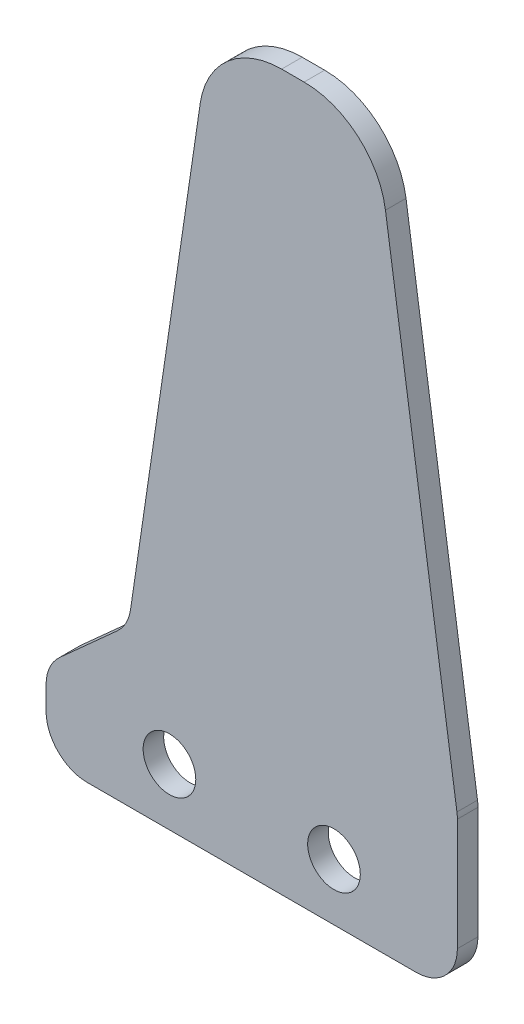
ISO-10303-21;
HEADER;
FILE_DESCRIPTION(('STEP AP214'),'2;1');
FILE_NAME('part.step','',(''),(''),'','','');
FILE_SCHEMA(('AUTOMOTIVE_DESIGN { 1 0 10303 214 1 1 1 1 }'));
ENDSEC;
DATA;
#1=APPLICATION_CONTEXT('core data for automotive mechanical design processes');
#2=APPLICATION_PROTOCOL_DEFINITION('international standard','automotive_design',2000,#1);
#3=PRODUCT_CONTEXT('',#1,'mechanical');
#4=PRODUCT('Part','Part','',(#3));
#5=PRODUCT_RELATED_PRODUCT_CATEGORY('part','',(#4));
#6=PRODUCT_DEFINITION_FORMATION('','',#4);
#7=PRODUCT_DEFINITION_CONTEXT('part definition',#1,'design');
#8=PRODUCT_DEFINITION('design','',#6,#7);
#9=PRODUCT_DEFINITION_SHAPE('','',#8);
#10=(LENGTH_UNIT() NAMED_UNIT(*) SI_UNIT(.MILLI.,.METRE.));
#11=(NAMED_UNIT(*) PLANE_ANGLE_UNIT() SI_UNIT($,.RADIAN.));
#12=(NAMED_UNIT(*) SI_UNIT($,.STERADIAN.) SOLID_ANGLE_UNIT());
#13=UNCERTAINTY_MEASURE_WITH_UNIT(LENGTH_MEASURE(1.E-05),#10,'distance_accuracy_value','');
#14=(GEOMETRIC_REPRESENTATION_CONTEXT(3) GLOBAL_UNCERTAINTY_ASSIGNED_CONTEXT((#13)) GLOBAL_UNIT_ASSIGNED_CONTEXT((#10,
#11,#12)) REPRESENTATION_CONTEXT('',''));
#15=CARTESIAN_POINT('',(0.,0.,0.));
#16=DIRECTION('',(0.,0.,1.));
#17=DIRECTION('',(1.,0.,0.));
#18=AXIS2_PLACEMENT_3D('',#15,#16,#17);
#19=CARTESIAN_POINT('',(0.,0.,1.5875));
#20=DIRECTION('',(0.,0.,1.));
#21=DIRECTION('',(1.,0.,0.));
#22=AXIS2_PLACEMENT_3D('',#19,#20,#21);
#23=PLANE('',#22);
#24=CARTESIAN_POINT('',(0.,0.,1.5875));
#25=DIRECTION('',(0.,0.,1.));
#26=DIRECTION('',(1.,0.,0.));
#27=AXIS2_PLACEMENT_3D('',#24,#25,#26);
#28=CIRCLE('',#27,2.032);
#29=CARTESIAN_POINT('',(2.032,0.,1.5875));
#30=VERTEX_POINT('',#29);
#31=EDGE_CURVE('E277',#30,#30,#28,.T.);
#32=ORIENTED_EDGE('',*,*,#31,.F.);
#33=EDGE_LOOP('',(#32));
#34=FACE_BOUND('',#33,.T.);
#35=DIRECTION('',(0.,1.,0.));
#36=VECTOR('',#35,1.);
#37=CARTESIAN_POINT('',(9.52500000000001,-4.3923682963395,1.5875));
#38=LINE('',#37,#36);
#39=CARTESIAN_POINT('',(9.52500000000001,-1.2173682963395,1.5875));
#40=VERTEX_POINT('',#39);
#41=CARTESIAN_POINT('',(9.52500000000001,7.43902293067184,1.5875));
#42=VERTEX_POINT('',#41);
#43=EDGE_CURVE('E270',#40,#42,#38,.T.);
#44=ORIENTED_EDGE('',*,*,#43,.T.);
#45=CARTESIAN_POINT('',(6.35000000000001,7.43902293067184,1.5875));
#46=DIRECTION('',(0.,0.,1.));
#47=DIRECTION('',(1.,0.,0.));
#48=AXIS2_PLACEMENT_3D('',#45,#46,#47);
#49=CIRCLE('',#48,3.175);
#50=CARTESIAN_POINT('',(9.49113580168159,7.90150630917772,1.5875));
#51=VERTEX_POINT('',#50);
#52=EDGE_CURVE('E244',#42,#51,#49,.T.);
#53=ORIENTED_EDGE('',*,*,#52,.T.);
#54=DIRECTION('',(-0.145664056222325,0.989334110765852,0.));
#55=VECTOR('',#54,1.);
#56=CARTESIAN_POINT('',(9.52500000000001,7.67150443088994,1.5875));
#57=LINE('',#56,#55);
#58=CARTESIAN_POINT('',(3.97375174495187,45.3749667570118,1.5875));
#59=VERTEX_POINT('',#58);
#60=EDGE_CURVE('E300',#51,#59,#57,.T.);
#61=ORIENTED_EDGE('',*,*,#60,.T.);
#62=CARTESIAN_POINT('',(-2.30851985841129,44.45,1.5875));
#63=DIRECTION('',(0.,0.,1.));
#64=DIRECTION('',(1.,0.,0.));
#65=AXIS2_PLACEMENT_3D('',#62,#63,#64);
#66=CIRCLE('',#65,6.35);
#67=CARTESIAN_POINT('',(-2.30851985841129,50.8,1.5875));
#68=VERTEX_POINT('',#67);
#69=EDGE_CURVE('E212',#59,#68,#66,.T.);
#70=ORIENTED_EDGE('',*,*,#69,.T.);
#71=DIRECTION('',(-1.,0.,0.));
#72=VECTOR('',#71,1.);
#73=CARTESIAN_POINT('',(3.17500000000001,50.8,1.5875));
#74=LINE('',#73,#72);
#75=CARTESIAN_POINT('',(-4.04148014158869,50.8,1.5875));
#76=VERTEX_POINT('',#75);
#77=EDGE_CURVE('E299',#68,#76,#74,.T.);
#78=ORIENTED_EDGE('',*,*,#77,.T.);
#79=CARTESIAN_POINT('',(-4.04148014158869,44.45,1.5875));
#80=DIRECTION('',(0.,0.,1.));
#81=DIRECTION('',(1.,0.,0.));
#82=AXIS2_PLACEMENT_3D('',#79,#80,#81);
#83=CIRCLE('',#82,6.35);
#84=CARTESIAN_POINT('',(-10.3237517449519,45.3749667570118,1.5875));
#85=VERTEX_POINT('',#84);
#86=EDGE_CURVE('E214',#76,#85,#83,.T.);
#87=ORIENTED_EDGE('',*,*,#86,.T.);
#88=DIRECTION('',(-0.145664056222325,-0.989334110765852,0.));
#89=VECTOR('',#88,1.);
#90=CARTESIAN_POINT('',(-9.52499999999999,50.8,1.5875));
#91=LINE('',#90,#89);
#92=CARTESIAN_POINT('',(-15.708301166504,8.80370441542636,1.5875));
#93=VERTEX_POINT('',#92);
#94=EDGE_CURVE('E182',#85,#93,#91,.T.);
#95=ORIENTED_EDGE('',*,*,#94,.T.);
#96=CARTESIAN_POINT('',(-18.8494369681856,9.26618779393224,1.5875));
#97=DIRECTION('',(0.,0.,1.));
#98=DIRECTION('',(1.,0.,0.));
#99=AXIS2_PLACEMENT_3D('',#96,#97,#98);
#100=CIRCLE('',#99,3.175);
#101=CARTESIAN_POINT('',(-16.7257054387108,6.90602055606234,1.5875));
#102=VERTEX_POINT('',#101);
#103=EDGE_CURVE('E11',#93,#102,#100,.F.);
#104=ORIENTED_EDGE('',*,*,#103,.T.);
#105=DIRECTION('',(-0.743359759959024,-0.668891820307037,0.));
#106=VECTOR('',#105,1.);
#107=CARTESIAN_POINT('',(-15.875,7.67150443088994,1.5875));
#108=LINE('',#107,#106);
#109=CARTESIAN_POINT('',(-21.1737315294748,2.9035867025156,1.5875));
#110=VERTEX_POINT('',#109);
#111=EDGE_CURVE('E268',#102,#110,#108,.T.);
#112=ORIENTED_EDGE('',*,*,#111,.T.);
#113=CARTESIAN_POINT('',(-19.05,0.5434194646457,1.5875));
#114=DIRECTION('',(0.,0.,1.));
#115=DIRECTION('',(1.,0.,0.));
#116=AXIS2_PLACEMENT_3D('',#113,#114,#115);
#117=CIRCLE('',#116,3.175);
#118=CARTESIAN_POINT('',(-22.225,0.5434194646457,1.5875));
#119=VERTEX_POINT('',#118);
#120=EDGE_CURVE('E237',#110,#119,#117,.T.);
#121=ORIENTED_EDGE('',*,*,#120,.T.);
#122=DIRECTION('',(0.,-1.,0.));
#123=VECTOR('',#122,1.);
#124=CARTESIAN_POINT('',(-22.225,1.9576317036605,1.5875));
#125=LINE('',#124,#123);
#126=CARTESIAN_POINT('',(-22.225,-1.2173682963395,1.5875));
#127=VERTEX_POINT('',#126);
#128=EDGE_CURVE('E183',#119,#127,#125,.T.);
#129=ORIENTED_EDGE('',*,*,#128,.T.);
#130=CARTESIAN_POINT('',(-19.05,-1.2173682963395,1.5875));
#131=DIRECTION('',(0.,0.,1.));
#132=DIRECTION('',(1.,0.,0.));
#133=AXIS2_PLACEMENT_3D('',#130,#131,#132);
#134=CIRCLE('',#133,3.175);
#135=CARTESIAN_POINT('',(-19.05,-4.3923682963395,1.5875));
#136=VERTEX_POINT('',#135);
#137=EDGE_CURVE('E73',#127,#136,#134,.T.);
#138=ORIENTED_EDGE('',*,*,#137,.T.);
#139=DIRECTION('',(1.,0.,0.));
#140=VECTOR('',#139,1.);
#141=CARTESIAN_POINT('',(-22.225,-4.3923682963395,1.5875));
#142=LINE('',#141,#140);
#143=CARTESIAN_POINT('',(6.35,-4.3923682963395,1.5875));
#144=VERTEX_POINT('',#143);
#145=EDGE_CURVE('E205',#136,#144,#142,.T.);
#146=ORIENTED_EDGE('',*,*,#145,.T.);
#147=CARTESIAN_POINT('',(6.35000000000001,-1.2173682963395,1.5875));
#148=DIRECTION('',(0.,0.,1.));
#149=DIRECTION('',(1.,0.,0.));
#150=AXIS2_PLACEMENT_3D('',#147,#148,#149);
#151=CIRCLE('',#150,3.175);
#152=EDGE_CURVE('E242',#144,#40,#151,.T.);
#153=ORIENTED_EDGE('',*,*,#152,.T.);
#154=EDGE_LOOP('',(#44,#53,#61,#70,#78,#87,#95,#104,#112,#121,#129,#138,#146,#153));
#155=FACE_BOUND('',#154,.T.);
#156=CARTESIAN_POINT('',(-12.7,0.,1.5875));
#157=DIRECTION('',(0.,0.,1.));
#158=DIRECTION('',(1.,0.,0.));
#159=AXIS2_PLACEMENT_3D('',#156,#157,#158);
#160=CIRCLE('',#159,2.032);
#161=CARTESIAN_POINT('',(-10.668,0.,1.5875));
#162=VERTEX_POINT('',#161);
#163=EDGE_CURVE('E341',#162,#162,#160,.T.);
#164=ORIENTED_EDGE('',*,*,#163,.F.);
#165=EDGE_LOOP('',(#164));
#166=FACE_BOUND('',#165,.T.);
#167=ADVANCED_FACE('F47',(#34,#155,#166),#23,.T.);
#168=CARTESIAN_POINT('',(0.,0.,0.));
#169=DIRECTION('',(0.,0.,1.));
#170=DIRECTION('',(1.,0.,0.));
#171=AXIS2_PLACEMENT_3D('',#168,#169,#170);
#172=PLANE('',#171);
#173=DIRECTION('',(-0.145664056222325,0.989334110765852,0.));
#174=VECTOR('',#173,1.);
#175=CARTESIAN_POINT('',(9.52500000000001,7.67150443088994,0.));
#176=LINE('',#175,#174);
#177=CARTESIAN_POINT('',(9.49113580168159,7.90150630917772,0.));
#178=VERTEX_POINT('',#177);
#179=CARTESIAN_POINT('',(3.97375174495187,45.3749667570118,0.));
#180=VERTEX_POINT('',#179);
#181=EDGE_CURVE('E199',#178,#180,#176,.T.);
#182=ORIENTED_EDGE('',*,*,#181,.F.);
#183=CARTESIAN_POINT('',(6.35000000000001,7.43902293067184,0.));
#184=DIRECTION('',(0.,0.,1.));
#185=DIRECTION('',(1.,0.,0.));
#186=AXIS2_PLACEMENT_3D('',#183,#184,#185);
#187=CIRCLE('',#186,3.175);
#188=CARTESIAN_POINT('',(9.52500000000001,7.43902293067184,0.));
#189=VERTEX_POINT('',#188);
#190=EDGE_CURVE('E230',#178,#189,#187,.F.);
#191=ORIENTED_EDGE('',*,*,#190,.T.);
#192=DIRECTION('',(0.,1.,0.));
#193=VECTOR('',#192,1.);
#194=CARTESIAN_POINT('',(9.52500000000001,-4.3923682963395,0.));
#195=LINE('',#194,#193);
#196=CARTESIAN_POINT('',(9.52500000000001,-1.2173682963395,0.));
#197=VERTEX_POINT('',#196);
#198=EDGE_CURVE('E276',#197,#189,#195,.T.);
#199=ORIENTED_EDGE('',*,*,#198,.F.);
#200=CARTESIAN_POINT('',(6.35000000000001,-1.2173682963395,0.));
#201=DIRECTION('',(0.,0.,1.));
#202=DIRECTION('',(1.,0.,0.));
#203=AXIS2_PLACEMENT_3D('',#200,#201,#202);
#204=CIRCLE('',#203,3.175);
#205=CARTESIAN_POINT('',(6.35,-4.3923682963395,0.));
#206=VERTEX_POINT('',#205);
#207=EDGE_CURVE('E228',#197,#206,#204,.F.);
#208=ORIENTED_EDGE('',*,*,#207,.T.);
#209=DIRECTION('',(1.,0.,0.));
#210=VECTOR('',#209,1.);
#211=CARTESIAN_POINT('',(-22.225,-4.3923682963395,0.));
#212=LINE('',#211,#210);
#213=CARTESIAN_POINT('',(-19.05,-4.3923682963395,0.));
#214=VERTEX_POINT('',#213);
#215=EDGE_CURVE('E275',#214,#206,#212,.T.);
#216=ORIENTED_EDGE('',*,*,#215,.F.);
#217=CARTESIAN_POINT('',(-19.05,-1.2173682963395,0.));
#218=DIRECTION('',(0.,0.,1.));
#219=DIRECTION('',(1.,0.,0.));
#220=AXIS2_PLACEMENT_3D('',#217,#218,#219);
#221=CIRCLE('',#220,3.175);
#222=CARTESIAN_POINT('',(-22.225,-1.2173682963395,0.));
#223=VERTEX_POINT('',#222);
#224=EDGE_CURVE('E225',#214,#223,#221,.F.);
#225=ORIENTED_EDGE('',*,*,#224,.T.);
#226=DIRECTION('',(0.,-1.,0.));
#227=VECTOR('',#226,1.);
#228=CARTESIAN_POINT('',(-22.225,1.9576317036605,0.));
#229=LINE('',#228,#227);
#230=CARTESIAN_POINT('',(-22.225,0.5434194646457,0.));
#231=VERTEX_POINT('',#230);
#232=EDGE_CURVE('E197',#231,#223,#229,.T.);
#233=ORIENTED_EDGE('',*,*,#232,.F.);
#234=CARTESIAN_POINT('',(-19.05,0.5434194646457,0.));
#235=DIRECTION('',(0.,0.,1.));
#236=DIRECTION('',(1.,0.,0.));
#237=AXIS2_PLACEMENT_3D('',#234,#235,#236);
#238=CIRCLE('',#237,3.175);
#239=CARTESIAN_POINT('',(-21.1737315294748,2.9035867025156,0.));
#240=VERTEX_POINT('',#239);
#241=EDGE_CURVE('E222',#231,#240,#238,.F.);
#242=ORIENTED_EDGE('',*,*,#241,.T.);
#243=DIRECTION('',(-0.743359759959024,-0.668891820307037,0.));
#244=VECTOR('',#243,1.);
#245=CARTESIAN_POINT('',(-15.875,7.67150443088994,0.));
#246=LINE('',#245,#244);
#247=CARTESIAN_POINT('',(-16.7257054387108,6.90602055606234,0.));
#248=VERTEX_POINT('',#247);
#249=EDGE_CURVE('E190',#248,#240,#246,.T.);
#250=ORIENTED_EDGE('',*,*,#249,.F.);
#251=CARTESIAN_POINT('',(-18.8494369681856,9.26618779393224,0.));
#252=DIRECTION('',(0.,0.,1.));
#253=DIRECTION('',(1.,0.,0.));
#254=AXIS2_PLACEMENT_3D('',#251,#252,#253);
#255=CIRCLE('',#254,3.175);
#256=CARTESIAN_POINT('',(-15.708301166504,8.80370441542636,0.));
#257=VERTEX_POINT('',#256);
#258=EDGE_CURVE('E56',#248,#257,#255,.T.);
#259=ORIENTED_EDGE('',*,*,#258,.T.);
#260=DIRECTION('',(-0.145664056222325,-0.989334110765852,0.));
#261=VECTOR('',#260,1.);
#262=CARTESIAN_POINT('',(-9.52499999999999,50.8,0.));
#263=LINE('',#262,#261);
#264=CARTESIAN_POINT('',(-10.3237517449519,45.3749667570118,0.));
#265=VERTEX_POINT('',#264);
#266=EDGE_CURVE('E179',#265,#257,#263,.T.);
#267=ORIENTED_EDGE('',*,*,#266,.F.);
#268=CARTESIAN_POINT('',(-4.04148014158869,44.45,0.));
#269=DIRECTION('',(0.,0.,1.));
#270=DIRECTION('',(1.,0.,0.));
#271=AXIS2_PLACEMENT_3D('',#268,#269,#270);
#272=CIRCLE('',#271,6.35);
#273=CARTESIAN_POINT('',(-4.04148014158869,50.8,0.));
#274=VERTEX_POINT('',#273);
#275=EDGE_CURVE('E162',#265,#274,#272,.F.);
#276=ORIENTED_EDGE('',*,*,#275,.T.);
#277=DIRECTION('',(-1.,0.,0.));
#278=VECTOR('',#277,1.);
#279=CARTESIAN_POINT('',(3.17500000000001,50.8,0.));
#280=LINE('',#279,#278);
#281=CARTESIAN_POINT('',(-2.30851985841129,50.8,0.));
#282=VERTEX_POINT('',#281);
#283=EDGE_CURVE('E191',#282,#274,#280,.T.);
#284=ORIENTED_EDGE('',*,*,#283,.F.);
#285=CARTESIAN_POINT('',(-2.30851985841129,44.45,0.));
#286=DIRECTION('',(0.,0.,1.));
#287=DIRECTION('',(1.,0.,0.));
#288=AXIS2_PLACEMENT_3D('',#285,#286,#287);
#289=CIRCLE('',#288,6.35);
#290=EDGE_CURVE('E173',#282,#180,#289,.F.);
#291=ORIENTED_EDGE('',*,*,#290,.T.);
#292=EDGE_LOOP('',(#182,#191,#199,#208,#216,#225,#233,#242,#250,#259,#267,#276,#284,#291));
#293=FACE_BOUND('',#292,.T.);
#294=CARTESIAN_POINT('',(0.,0.,0.));
#295=DIRECTION('',(0.,0.,1.));
#296=DIRECTION('',(1.,0.,0.));
#297=AXIS2_PLACEMENT_3D('',#294,#295,#296);
#298=CIRCLE('',#297,2.032);
#299=CARTESIAN_POINT('',(2.032,0.,0.));
#300=VERTEX_POINT('',#299);
#301=EDGE_CURVE('E283',#300,#300,#298,.T.);
#302=ORIENTED_EDGE('',*,*,#301,.T.);
#303=EDGE_LOOP('',(#302));
#304=FACE_BOUND('',#303,.T.);
#305=CARTESIAN_POINT('',(-12.7,0.,0.));
#306=DIRECTION('',(0.,0.,1.));
#307=DIRECTION('',(1.,0.,0.));
#308=AXIS2_PLACEMENT_3D('',#305,#306,#307);
#309=CIRCLE('',#308,2.032);
#310=CARTESIAN_POINT('',(-10.668,0.,0.));
#311=VERTEX_POINT('',#310);
#312=EDGE_CURVE('E343',#311,#311,#309,.T.);
#313=ORIENTED_EDGE('',*,*,#312,.T.);
#314=EDGE_LOOP('',(#313));
#315=FACE_BOUND('',#314,.T.);
#316=ADVANCED_FACE('F186',(#293,#304,#315),#172,.F.);
#317=CARTESIAN_POINT('',(-22.225,-4.3923682963395,1.5875));
#318=DIRECTION('',(0.,1.,0.));
#319=DIRECTION('',(0.,0.,1.));
#320=AXIS2_PLACEMENT_3D('',#317,#318,#319);
#321=PLANE('',#320);
#322=ORIENTED_EDGE('',*,*,#215,.T.);
#323=DIRECTION('',(0.,0.,-1.));
#324=VECTOR('',#323,1.);
#325=CARTESIAN_POINT('',(6.35,-4.3923682963395,1.5875));
#326=LINE('',#325,#324);
#327=EDGE_CURVE('E63',#206,#144,#326,.F.);
#328=ORIENTED_EDGE('',*,*,#327,.T.);
#329=ORIENTED_EDGE('',*,*,#145,.F.);
#330=DIRECTION('',(0.,0.,-1.));
#331=VECTOR('',#330,1.);
#332=CARTESIAN_POINT('',(-19.05,-4.3923682963395,1.5875));
#333=LINE('',#332,#331);
#334=EDGE_CURVE('E246',#136,#214,#333,.T.);
#335=ORIENTED_EDGE('',*,*,#334,.T.);
#336=EDGE_LOOP('',(#322,#328,#329,#335));
#337=FACE_BOUND('',#336,.T.);
#338=ADVANCED_FACE('F326',(#337),#321,.F.);
#339=CARTESIAN_POINT('',(9.52500000000001,-4.3923682963395,1.5875));
#340=DIRECTION('',(-1.,0.,0.));
#341=DIRECTION('',(0.,0.,1.));
#342=AXIS2_PLACEMENT_3D('',#339,#340,#341);
#343=PLANE('',#342);
#344=ORIENTED_EDGE('',*,*,#198,.T.);
#345=DIRECTION('',(0.,0.,-1.));
#346=VECTOR('',#345,1.);
#347=CARTESIAN_POINT('',(9.52500000000001,7.43902293067184,1.5875));
#348=LINE('',#347,#346);
#349=EDGE_CURVE('E235',#189,#42,#348,.F.);
#350=ORIENTED_EDGE('',*,*,#349,.T.);
#351=ORIENTED_EDGE('',*,*,#43,.F.);
#352=DIRECTION('',(0.,0.,-1.));
#353=VECTOR('',#352,1.);
#354=CARTESIAN_POINT('',(9.52500000000001,-1.2173682963395,1.5875));
#355=LINE('',#354,#353);
#356=EDGE_CURVE('E232',#40,#197,#355,.T.);
#357=ORIENTED_EDGE('',*,*,#356,.T.);
#358=EDGE_LOOP('',(#344,#350,#351,#357));
#359=FACE_BOUND('',#358,.T.);
#360=ADVANCED_FACE('F334',(#359),#343,.F.);
#361=CARTESIAN_POINT('',(9.52500000000001,7.67150443088994,1.5875));
#362=DIRECTION('',(-0.989334110765852,-0.145664056222325,0.));
#363=DIRECTION('',(0.145664056222325,-0.989334110765852,0.));
#364=AXIS2_PLACEMENT_3D('',#361,#362,#363);
#365=PLANE('',#364);
#366=ORIENTED_EDGE('',*,*,#60,.F.);
#367=DIRECTION('',(0.,0.,-1.));
#368=VECTOR('',#367,1.);
#369=CARTESIAN_POINT('',(9.49113580168159,7.90150630917772,1.5875));
#370=LINE('',#369,#368);
#371=EDGE_CURVE('E219',#51,#178,#370,.T.);
#372=ORIENTED_EDGE('',*,*,#371,.T.);
#373=ORIENTED_EDGE('',*,*,#181,.T.);
#374=DIRECTION('',(0.,0.,-1.));
#375=VECTOR('',#374,1.);
#376=CARTESIAN_POINT('',(3.97375174495187,45.3749667570118,1.5875));
#377=LINE('',#376,#375);
#378=EDGE_CURVE('E216',#180,#59,#377,.F.);
#379=ORIENTED_EDGE('',*,*,#378,.T.);
#380=EDGE_LOOP('',(#366,#372,#373,#379));
#381=FACE_BOUND('',#380,.T.);
#382=ADVANCED_FACE('F288',(#381),#365,.F.);
#383=CARTESIAN_POINT('',(3.17500000000001,50.8,1.5875));
#384=DIRECTION('',(0.,-1.,0.));
#385=DIRECTION('',(0.,0.,-1.));
#386=AXIS2_PLACEMENT_3D('',#383,#384,#385);
#387=PLANE('',#386);
#388=ORIENTED_EDGE('',*,*,#283,.T.);
#389=DIRECTION('',(0.,0.,-1.));
#390=VECTOR('',#389,1.);
#391=CARTESIAN_POINT('',(-4.04148014158869,50.8,1.5875));
#392=LINE('',#391,#390);
#393=EDGE_CURVE('E167',#274,#76,#392,.F.);
#394=ORIENTED_EDGE('',*,*,#393,.T.);
#395=ORIENTED_EDGE('',*,*,#77,.F.);
#396=DIRECTION('',(0.,0.,-1.));
#397=VECTOR('',#396,1.);
#398=CARTESIAN_POINT('',(-2.30851985841129,50.8,1.5875));
#399=LINE('',#398,#397);
#400=EDGE_CURVE('E172',#68,#282,#399,.T.);
#401=ORIENTED_EDGE('',*,*,#400,.T.);
#402=EDGE_LOOP('',(#388,#394,#395,#401));
#403=FACE_BOUND('',#402,.T.);
#404=ADVANCED_FACE('F302',(#403),#387,.F.);
#405=CARTESIAN_POINT('',(-9.52499999999999,50.8,1.5875));
#406=DIRECTION('',(0.989334110765852,-0.145664056222325,0.));
#407=DIRECTION('',(0.145664056222325,0.989334110765852,0.));
#408=AXIS2_PLACEMENT_3D('',#405,#406,#407);
#409=PLANE('',#408);
#410=ORIENTED_EDGE('',*,*,#266,.T.);
#411=DIRECTION('',(0.,0.,-1.));
#412=VECTOR('',#411,1.);
#413=CARTESIAN_POINT('',(-15.708301166504,8.80370441542636,1.5875));
#414=LINE('',#413,#412);
#415=EDGE_CURVE('E265',#257,#93,#414,.F.);
#416=ORIENTED_EDGE('',*,*,#415,.T.);
#417=ORIENTED_EDGE('',*,*,#94,.F.);
#418=DIRECTION('',(0.,0.,-1.));
#419=VECTOR('',#418,1.);
#420=CARTESIAN_POINT('',(-10.3237517449519,45.3749667570118,1.5875));
#421=LINE('',#420,#419);
#422=EDGE_CURVE('E166',#85,#265,#421,.T.);
#423=ORIENTED_EDGE('',*,*,#422,.T.);
#424=EDGE_LOOP('',(#410,#416,#417,#423));
#425=FACE_BOUND('',#424,.T.);
#426=ADVANCED_FACE('F178',(#425),#409,.F.);
#427=CARTESIAN_POINT('',(-15.875,7.67150443088994,1.5875));
#428=DIRECTION('',(0.668891820307037,-0.743359759959024,0.));
#429=DIRECTION('',(0.743359759959024,0.668891820307037,0.));
#430=AXIS2_PLACEMENT_3D('',#427,#428,#429);
#431=PLANE('',#430);
#432=ORIENTED_EDGE('',*,*,#249,.T.);
#433=DIRECTION('',(0.,0.,-1.));
#434=VECTOR('',#433,1.);
#435=CARTESIAN_POINT('',(-21.1737315294748,2.9035867025156,1.5875));
#436=LINE('',#435,#434);
#437=EDGE_CURVE('E262',#240,#110,#436,.F.);
#438=ORIENTED_EDGE('',*,*,#437,.T.);
#439=ORIENTED_EDGE('',*,*,#111,.F.);
#440=DIRECTION('',(0.,0.,-1.));
#441=VECTOR('',#440,1.);
#442=CARTESIAN_POINT('',(-16.7257054387108,6.90602055606234,0.));
#443=LINE('',#442,#441);
#444=EDGE_CURVE('E258',#102,#248,#443,.T.);
#445=ORIENTED_EDGE('',*,*,#444,.T.);
#446=EDGE_LOOP('',(#432,#438,#439,#445));
#447=FACE_BOUND('',#446,.T.);
#448=ADVANCED_FACE('F366',(#447),#431,.F.);
#449=CARTESIAN_POINT('',(-22.225,1.9576317036605,1.5875));
#450=DIRECTION('',(1.,0.,0.));
#451=DIRECTION('',(0.,0.,-1.));
#452=AXIS2_PLACEMENT_3D('',#449,#450,#451);
#453=PLANE('',#452);
#454=ORIENTED_EDGE('',*,*,#232,.T.);
#455=DIRECTION('',(0.,0.,-1.));
#456=VECTOR('',#455,1.);
#457=CARTESIAN_POINT('',(-22.225,-1.2173682963395,1.5875));
#458=LINE('',#457,#456);
#459=EDGE_CURVE('E255',#223,#127,#458,.F.);
#460=ORIENTED_EDGE('',*,*,#459,.T.);
#461=ORIENTED_EDGE('',*,*,#128,.F.);
#462=DIRECTION('',(0.,0.,-1.));
#463=VECTOR('',#462,1.);
#464=CARTESIAN_POINT('',(-22.225,0.5434194646457,1.5875));
#465=LINE('',#464,#463);
#466=EDGE_CURVE('E251',#119,#231,#465,.T.);
#467=ORIENTED_EDGE('',*,*,#466,.T.);
#468=EDGE_LOOP('',(#454,#460,#461,#467));
#469=FACE_BOUND('',#468,.T.);
#470=ADVANCED_FACE('F321',(#469),#453,.F.);
#471=CARTESIAN_POINT('',(0.,0.,1.5875));
#472=DIRECTION('',(0.,0.,-1.));
#473=DIRECTION('',(-1.,0.,0.));
#474=AXIS2_PLACEMENT_3D('',#471,#472,#473);
#475=CYLINDRICAL_SURFACE('',#474,2.032);
#476=ORIENTED_EDGE('',*,*,#31,.T.);
#477=EDGE_LOOP('',(#476));
#478=FACE_BOUND('',#477,.T.);
#479=ORIENTED_EDGE('',*,*,#301,.F.);
#480=EDGE_LOOP('',(#479));
#481=FACE_BOUND('',#480,.T.);
#482=ADVANCED_FACE('F361',(#478,#481),#475,.F.);
#483=CARTESIAN_POINT('',(-12.7,0.,1.5875));
#484=DIRECTION('',(0.,0.,-1.));
#485=DIRECTION('',(-1.,0.,0.));
#486=AXIS2_PLACEMENT_3D('',#483,#484,#485);
#487=CYLINDRICAL_SURFACE('',#486,2.032);
#488=ORIENTED_EDGE('',*,*,#163,.T.);
#489=EDGE_LOOP('',(#488));
#490=FACE_BOUND('',#489,.T.);
#491=ORIENTED_EDGE('',*,*,#312,.F.);
#492=EDGE_LOOP('',(#491));
#493=FACE_BOUND('',#492,.T.);
#494=ADVANCED_FACE('F350',(#490,#493),#487,.F.);
#495=CARTESIAN_POINT('',(-4.04148014158869,44.45,1.5875));
#496=DIRECTION('',(0.,0.,-1.));
#497=DIRECTION('',(-1.,0.,0.));
#498=AXIS2_PLACEMENT_3D('',#495,#496,#497);
#499=CYLINDRICAL_SURFACE('',#498,6.35);
#500=ORIENTED_EDGE('',*,*,#86,.F.);
#501=ORIENTED_EDGE('',*,*,#393,.F.);
#502=ORIENTED_EDGE('',*,*,#275,.F.);
#503=ORIENTED_EDGE('',*,*,#422,.F.);
#504=EDGE_LOOP('',(#500,#501,#502,#503));
#505=FACE_BOUND('',#504,.T.);
#506=ADVANCED_FACE('F165',(#505),#499,.T.);
#507=CARTESIAN_POINT('',(-2.30851985841129,44.45,1.5875));
#508=DIRECTION('',(0.,0.,-1.));
#509=DIRECTION('',(-1.,0.,0.));
#510=AXIS2_PLACEMENT_3D('',#507,#508,#509);
#511=CYLINDRICAL_SURFACE('',#510,6.35);
#512=ORIENTED_EDGE('',*,*,#69,.F.);
#513=ORIENTED_EDGE('',*,*,#378,.F.);
#514=ORIENTED_EDGE('',*,*,#290,.F.);
#515=ORIENTED_EDGE('',*,*,#400,.F.);
#516=EDGE_LOOP('',(#512,#513,#514,#515));
#517=FACE_BOUND('',#516,.T.);
#518=ADVANCED_FACE('F294',(#517),#511,.T.);
#519=CARTESIAN_POINT('',(6.35000000000001,7.43902293067184,1.5875));
#520=DIRECTION('',(0.,0.,-1.));
#521=DIRECTION('',(-1.,0.,0.));
#522=AXIS2_PLACEMENT_3D('',#519,#520,#521);
#523=CYLINDRICAL_SURFACE('',#522,3.175);
#524=ORIENTED_EDGE('',*,*,#52,.F.);
#525=ORIENTED_EDGE('',*,*,#349,.F.);
#526=ORIENTED_EDGE('',*,*,#190,.F.);
#527=ORIENTED_EDGE('',*,*,#371,.F.);
#528=EDGE_LOOP('',(#524,#525,#526,#527));
#529=FACE_BOUND('',#528,.T.);
#530=ADVANCED_FACE('F338',(#529),#523,.T.);
#531=CARTESIAN_POINT('',(6.35000000000001,-1.2173682963395,1.5875));
#532=DIRECTION('',(0.,0.,-1.));
#533=DIRECTION('',(-1.,0.,0.));
#534=AXIS2_PLACEMENT_3D('',#531,#532,#533);
#535=CYLINDRICAL_SURFACE('',#534,3.175);
#536=ORIENTED_EDGE('',*,*,#152,.F.);
#537=ORIENTED_EDGE('',*,*,#327,.F.);
#538=ORIENTED_EDGE('',*,*,#207,.F.);
#539=ORIENTED_EDGE('',*,*,#356,.F.);
#540=EDGE_LOOP('',(#536,#537,#538,#539));
#541=FACE_BOUND('',#540,.T.);
#542=ADVANCED_FACE('F331',(#541),#535,.T.);
#543=CARTESIAN_POINT('',(-19.05,-1.2173682963395,1.5875));
#544=DIRECTION('',(0.,0.,-1.));
#545=DIRECTION('',(-1.,0.,0.));
#546=AXIS2_PLACEMENT_3D('',#543,#544,#545);
#547=CYLINDRICAL_SURFACE('',#546,3.175);
#548=ORIENTED_EDGE('',*,*,#137,.F.);
#549=ORIENTED_EDGE('',*,*,#459,.F.);
#550=ORIENTED_EDGE('',*,*,#224,.F.);
#551=ORIENTED_EDGE('',*,*,#334,.F.);
#552=EDGE_LOOP('',(#548,#549,#550,#551));
#553=FACE_BOUND('',#552,.T.);
#554=ADVANCED_FACE('F325',(#553),#547,.T.);
#555=CARTESIAN_POINT('',(-19.05,0.5434194646457,1.5875));
#556=DIRECTION('',(0.,0.,-1.));
#557=DIRECTION('',(-1.,0.,0.));
#558=AXIS2_PLACEMENT_3D('',#555,#556,#557);
#559=CYLINDRICAL_SURFACE('',#558,3.175);
#560=ORIENTED_EDGE('',*,*,#120,.F.);
#561=ORIENTED_EDGE('',*,*,#437,.F.);
#562=ORIENTED_EDGE('',*,*,#241,.F.);
#563=ORIENTED_EDGE('',*,*,#466,.F.);
#564=EDGE_LOOP('',(#560,#561,#562,#563));
#565=FACE_BOUND('',#564,.T.);
#566=ADVANCED_FACE('F318',(#565),#559,.T.);
#567=CARTESIAN_POINT('',(-18.8494369681856,9.26618779393224,1.5875));
#568=DIRECTION('',(0.,0.,1.));
#569=DIRECTION('',(1.,0.,0.));
#570=AXIS2_PLACEMENT_3D('',#567,#568,#569);
#571=CYLINDRICAL_SURFACE('',#570,3.175);
#572=ORIENTED_EDGE('',*,*,#103,.F.);
#573=ORIENTED_EDGE('',*,*,#415,.F.);
#574=ORIENTED_EDGE('',*,*,#258,.F.);
#575=ORIENTED_EDGE('',*,*,#444,.F.);
#576=EDGE_LOOP('',(#572,#573,#574,#575));
#577=FACE_BOUND('',#576,.T.);
#578=ADVANCED_FACE('F49',(#577),#571,.F.);
#579=CLOSED_SHELL('',(#167,#316,#338,#360,#382,#404,#426,#448,#470,#482,#494,#506,#518,#530,
#542,#554,#566,#578));
#580=MANIFOLD_SOLID_BREP('B2',#579);
#581=ADVANCED_BREP_SHAPE_REPRESENTATION('',(#18,#580),#14);
#582=SHAPE_DEFINITION_REPRESENTATION(#9,#581);
ENDSEC;
END-ISO-10303-21;
